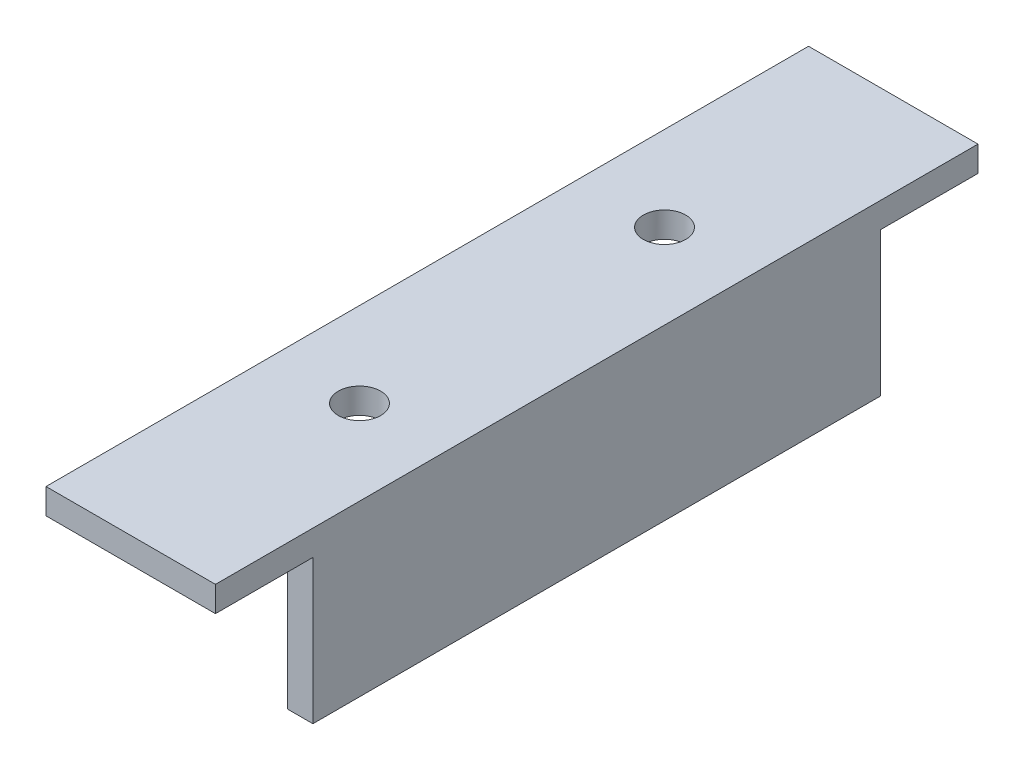
ISO-10303-21;
HEADER;
FILE_DESCRIPTION(('STEP AP214'),'2;1');
FILE_NAME('part.step','',(''),(''),'','','');
FILE_SCHEMA(('AUTOMOTIVE_DESIGN { 1 0 10303 214 1 1 1 1 }'));
ENDSEC;
DATA;
#1=APPLICATION_CONTEXT('core data for automotive mechanical design processes');
#2=APPLICATION_PROTOCOL_DEFINITION('international standard','automotive_design',2000,#1);
#3=PRODUCT_CONTEXT('',#1,'mechanical');
#4=PRODUCT('Part','Part','',(#3));
#5=PRODUCT_RELATED_PRODUCT_CATEGORY('part','',(#4));
#6=PRODUCT_DEFINITION_FORMATION('','',#4);
#7=PRODUCT_DEFINITION_CONTEXT('part definition',#1,'design');
#8=PRODUCT_DEFINITION('design','',#6,#7);
#9=PRODUCT_DEFINITION_SHAPE('','',#8);
#10=(LENGTH_UNIT() NAMED_UNIT(*) SI_UNIT(.MILLI.,.METRE.));
#11=(NAMED_UNIT(*) PLANE_ANGLE_UNIT() SI_UNIT($,.RADIAN.));
#12=(NAMED_UNIT(*) SI_UNIT($,.STERADIAN.) SOLID_ANGLE_UNIT());
#13=UNCERTAINTY_MEASURE_WITH_UNIT(LENGTH_MEASURE(1.E-05),#10,'distance_accuracy_value','');
#14=(GEOMETRIC_REPRESENTATION_CONTEXT(3) GLOBAL_UNCERTAINTY_ASSIGNED_CONTEXT((#13)) GLOBAL_UNIT_ASSIGNED_CONTEXT((#10,
#11,#12)) REPRESENTATION_CONTEXT('',''));
#15=CARTESIAN_POINT('',(0.,0.,0.));
#16=DIRECTION('',(0.,0.,1.));
#17=DIRECTION('',(1.,0.,0.));
#18=AXIS2_PLACEMENT_3D('',#15,#16,#17);
#19=CARTESIAN_POINT('',(0.,-6.,-180.));
#20=DIRECTION('',(-1.,0.,0.));
#21=DIRECTION('',(0.,0.,1.));
#22=AXIS2_PLACEMENT_3D('',#19,#20,#21);
#23=PLANE('',#22);
#24=DIRECTION('',(0.,-1.,0.));
#25=VECTOR('',#24,1.);
#26=CARTESIAN_POINT('',(0.,-6.,0.));
#27=LINE('',#26,#25);
#28=CARTESIAN_POINT('',(0.,0.,0.));
#29=VERTEX_POINT('',#28);
#30=CARTESIAN_POINT('',(0.,-6.,0.));
#31=VERTEX_POINT('',#30);
#32=EDGE_CURVE('E169',#29,#31,#27,.T.);
#33=ORIENTED_EDGE('',*,*,#32,.F.);
#34=DIRECTION('',(0.,0.,1.));
#35=VECTOR('',#34,1.);
#36=CARTESIAN_POINT('',(0.,0.,-180.));
#37=LINE('',#36,#35);
#38=CARTESIAN_POINT('',(0.,0.,-180.));
#39=VERTEX_POINT('',#38);
#40=EDGE_CURVE('E11',#39,#29,#37,.T.);
#41=ORIENTED_EDGE('',*,*,#40,.F.);
#42=DIRECTION('',(0.,-1.,0.));
#43=VECTOR('',#42,1.);
#44=CARTESIAN_POINT('',(0.,-6.,-180.));
#45=LINE('',#44,#43);
#46=CARTESIAN_POINT('',(0.,-6.,-180.));
#47=VERTEX_POINT('',#46);
#48=EDGE_CURVE('E170',#39,#47,#45,.T.);
#49=ORIENTED_EDGE('',*,*,#48,.T.);
#50=DIRECTION('',(0.,0.,1.));
#51=VECTOR('',#50,1.);
#52=CARTESIAN_POINT('',(0.,-6.,-180.));
#53=LINE('',#52,#51);
#54=EDGE_CURVE('E83',#47,#31,#53,.T.);
#55=ORIENTED_EDGE('',*,*,#54,.T.);
#56=EDGE_LOOP('',(#33,#41,#49,#55));
#57=FACE_BOUND('',#56,.T.);
#58=ADVANCED_FACE('F41',(#57),#23,.T.);
#59=CARTESIAN_POINT('',(0.,0.,-180.));
#60=DIRECTION('',(0.,1.,0.));
#61=DIRECTION('',(0.,0.,1.));
#62=AXIS2_PLACEMENT_3D('',#59,#60,#61);
#63=PLANE('',#62);
#64=CARTESIAN_POINT('',(20.,0.,-126.));
#65=DIRECTION('',(0.,1.,0.));
#66=DIRECTION('',(0.,0.,1.));
#67=AXIS2_PLACEMENT_3D('',#64,#65,#66);
#68=CIRCLE('',#67,5.);
#69=CARTESIAN_POINT('',(20.,0.,-121.));
#70=VERTEX_POINT('',#69);
#71=EDGE_CURVE('E145',#70,#70,#68,.T.);
#72=ORIENTED_EDGE('',*,*,#71,.F.);
#73=EDGE_LOOP('',(#72));
#74=FACE_BOUND('',#73,.T.);
#75=CARTESIAN_POINT('',(20.,0.,-54.));
#76=DIRECTION('',(0.,1.,0.));
#77=DIRECTION('',(0.,0.,-1.));
#78=AXIS2_PLACEMENT_3D('',#75,#76,#77);
#79=CIRCLE('',#78,5.);
#80=CARTESIAN_POINT('',(20.,0.,-59.));
#81=VERTEX_POINT('',#80);
#82=EDGE_CURVE('E150',#81,#81,#79,.T.);
#83=ORIENTED_EDGE('',*,*,#82,.F.);
#84=EDGE_LOOP('',(#83));
#85=FACE_BOUND('',#84,.T.);
#86=DIRECTION('',(-1.,0.,0.));
#87=VECTOR('',#86,1.);
#88=CARTESIAN_POINT('',(0.,0.,0.));
#89=LINE('',#88,#87);
#90=CARTESIAN_POINT('',(40.,0.,0.));
#91=VERTEX_POINT('',#90);
#92=EDGE_CURVE('E173',#91,#29,#89,.T.);
#93=ORIENTED_EDGE('',*,*,#92,.F.);
#94=DIRECTION('',(0.,0.,1.));
#95=VECTOR('',#94,1.);
#96=CARTESIAN_POINT('',(40.,0.,-180.));
#97=LINE('',#96,#95);
#98=CARTESIAN_POINT('',(40.,0.,-180.));
#99=VERTEX_POINT('',#98);
#100=EDGE_CURVE('E49',#99,#91,#97,.T.);
#101=ORIENTED_EDGE('',*,*,#100,.F.);
#102=DIRECTION('',(-1.,0.,0.));
#103=VECTOR('',#102,1.);
#104=CARTESIAN_POINT('',(0.,0.,-180.));
#105=LINE('',#104,#103);
#106=EDGE_CURVE('E140',#99,#39,#105,.T.);
#107=ORIENTED_EDGE('',*,*,#106,.T.);
#108=ORIENTED_EDGE('',*,*,#40,.T.);
#109=EDGE_LOOP('',(#93,#101,#107,#108));
#110=FACE_BOUND('',#109,.T.);
#111=ADVANCED_FACE('F201',(#74,#85,#110),#63,.T.);
#112=CARTESIAN_POINT('',(40.,0.,-180.));
#113=DIRECTION('',(1.,0.,0.));
#114=DIRECTION('',(0.,0.,-1.));
#115=AXIS2_PLACEMENT_3D('',#112,#113,#114);
#116=PLANE('',#115);
#117=DIRECTION('',(0.,1.,0.));
#118=VECTOR('',#117,1.);
#119=CARTESIAN_POINT('',(40.,0.,-23.));
#120=LINE('',#119,#118);
#121=CARTESIAN_POINT('',(40.,-40.,-23.));
#122=VERTEX_POINT('',#121);
#123=CARTESIAN_POINT('',(40.,-6.,-23.));
#124=VERTEX_POINT('',#123);
#125=EDGE_CURVE('E118',#122,#124,#120,.T.);
#126=ORIENTED_EDGE('',*,*,#125,.F.);
#127=DIRECTION('',(0.,0.,1.));
#128=VECTOR('',#127,1.);
#129=CARTESIAN_POINT('',(40.,-40.,-180.));
#130=LINE('',#129,#128);
#131=CARTESIAN_POINT('',(40.,-40.,-157.));
#132=VERTEX_POINT('',#131);
#133=EDGE_CURVE('E138',#132,#122,#130,.T.);
#134=ORIENTED_EDGE('',*,*,#133,.F.);
#135=DIRECTION('',(0.,-1.,0.));
#136=VECTOR('',#135,1.);
#137=CARTESIAN_POINT('',(40.,0.,-157.));
#138=LINE('',#137,#136);
#139=CARTESIAN_POINT('',(40.,-6.,-157.));
#140=VERTEX_POINT('',#139);
#141=EDGE_CURVE('E166',#140,#132,#138,.T.);
#142=ORIENTED_EDGE('',*,*,#141,.F.);
#143=DIRECTION('',(0.,0.,1.));
#144=VECTOR('',#143,1.);
#145=CARTESIAN_POINT('',(40.,-6.,-180.));
#146=LINE('',#145,#144);
#147=CARTESIAN_POINT('',(40.,-6.,-180.));
#148=VERTEX_POINT('',#147);
#149=EDGE_CURVE('E164',#148,#140,#146,.T.);
#150=ORIENTED_EDGE('',*,*,#149,.F.);
#151=DIRECTION('',(0.,1.,0.));
#152=VECTOR('',#151,1.);
#153=CARTESIAN_POINT('',(40.,0.,-180.));
#154=LINE('',#153,#152);
#155=EDGE_CURVE('E175',#148,#99,#154,.T.);
#156=ORIENTED_EDGE('',*,*,#155,.T.);
#157=ORIENTED_EDGE('',*,*,#100,.T.);
#158=DIRECTION('',(0.,1.,0.));
#159=VECTOR('',#158,1.);
#160=CARTESIAN_POINT('',(40.,0.,0.));
#161=LINE('',#160,#159);
#162=CARTESIAN_POINT('',(40.,-6.,0.));
#163=VERTEX_POINT('',#162);
#164=EDGE_CURVE('E180',#163,#91,#161,.T.);
#165=ORIENTED_EDGE('',*,*,#164,.F.);
#166=DIRECTION('',(0.,0.,1.));
#167=VECTOR('',#166,1.);
#168=CARTESIAN_POINT('',(40.,-6.00000000000002,-180.));
#169=LINE('',#168,#167);
#170=EDGE_CURVE('E157',#124,#163,#169,.T.);
#171=ORIENTED_EDGE('',*,*,#170,.F.);
#172=EDGE_LOOP('',(#126,#134,#142,#150,#156,#157,#165,#171));
#173=FACE_BOUND('',#172,.T.);
#174=ADVANCED_FACE('F192',(#173),#116,.T.);
#175=CARTESIAN_POINT('',(34.,-40.,-180.));
#176=DIRECTION('',(0.,-1.,0.));
#177=DIRECTION('',(0.,0.,-1.));
#178=AXIS2_PLACEMENT_3D('',#175,#176,#177);
#179=PLANE('',#178);
#180=DIRECTION('',(-1.,0.,0.));
#181=VECTOR('',#180,1.);
#182=CARTESIAN_POINT('',(234.,-40.,-23.));
#183=LINE('',#182,#181);
#184=CARTESIAN_POINT('',(34.,-40.,-23.));
#185=VERTEX_POINT('',#184);
#186=EDGE_CURVE('E121',#122,#185,#183,.T.);
#187=ORIENTED_EDGE('',*,*,#186,.T.);
#188=DIRECTION('',(0.,0.,1.));
#189=VECTOR('',#188,1.);
#190=CARTESIAN_POINT('',(34.,-40.,-180.));
#191=LINE('',#190,#189);
#192=CARTESIAN_POINT('',(34.,-40.,-157.));
#193=VERTEX_POINT('',#192);
#194=EDGE_CURVE('E130',#193,#185,#191,.T.);
#195=ORIENTED_EDGE('',*,*,#194,.F.);
#196=DIRECTION('',(-1.,0.,0.));
#197=VECTOR('',#196,1.);
#198=CARTESIAN_POINT('',(234.,-40.,-157.));
#199=LINE('',#198,#197);
#200=EDGE_CURVE('E159',#132,#193,#199,.T.);
#201=ORIENTED_EDGE('',*,*,#200,.F.);
#202=ORIENTED_EDGE('',*,*,#133,.T.);
#203=EDGE_LOOP('',(#187,#195,#201,#202));
#204=FACE_BOUND('',#203,.T.);
#205=ADVANCED_FACE('F189',(#204),#179,.T.);
#206=CARTESIAN_POINT('',(34.,-6.,-180.));
#207=DIRECTION('',(-1.,0.,0.));
#208=DIRECTION('',(0.,0.,1.));
#209=AXIS2_PLACEMENT_3D('',#206,#207,#208);
#210=PLANE('',#209);
#211=DIRECTION('',(0.,-1.,0.));
#212=VECTOR('',#211,1.);
#213=CARTESIAN_POINT('',(34.,-6.,-23.));
#214=LINE('',#213,#212);
#215=CARTESIAN_POINT('',(34.,-6.,-23.));
#216=VERTEX_POINT('',#215);
#217=EDGE_CURVE('E115',#216,#185,#214,.T.);
#218=ORIENTED_EDGE('',*,*,#217,.F.);
#219=DIRECTION('',(0.,0.,1.));
#220=VECTOR('',#219,1.);
#221=CARTESIAN_POINT('',(34.,-6.,-180.));
#222=LINE('',#221,#220);
#223=CARTESIAN_POINT('',(34.,-6.,-157.));
#224=VERTEX_POINT('',#223);
#225=EDGE_CURVE('E128',#224,#216,#222,.T.);
#226=ORIENTED_EDGE('',*,*,#225,.F.);
#227=DIRECTION('',(0.,1.,0.));
#228=VECTOR('',#227,1.);
#229=CARTESIAN_POINT('',(34.,-6.,-157.));
#230=LINE('',#229,#228);
#231=EDGE_CURVE('E131',#193,#224,#230,.T.);
#232=ORIENTED_EDGE('',*,*,#231,.F.);
#233=ORIENTED_EDGE('',*,*,#194,.T.);
#234=EDGE_LOOP('',(#218,#226,#232,#233));
#235=FACE_BOUND('',#234,.T.);
#236=ADVANCED_FACE('F126',(#235),#210,.T.);
#237=CARTESIAN_POINT('',(0.,-6.,-180.));
#238=DIRECTION('',(0.,-1.,0.));
#239=DIRECTION('',(0.,0.,-1.));
#240=AXIS2_PLACEMENT_3D('',#237,#238,#239);
#241=PLANE('',#240);
#242=CARTESIAN_POINT('',(20.,-6.00000000000001,-126.));
#243=DIRECTION('',(0.,-1.,0.));
#244=DIRECTION('',(0.,0.,-1.));
#245=AXIS2_PLACEMENT_3D('',#242,#243,#244);
#246=CIRCLE('',#245,5.);
#247=CARTESIAN_POINT('',(20.,-6.00000000000001,-131.));
#248=VERTEX_POINT('',#247);
#249=EDGE_CURVE('E44',#248,#248,#246,.T.);
#250=ORIENTED_EDGE('',*,*,#249,.F.);
#251=EDGE_LOOP('',(#250));
#252=FACE_BOUND('',#251,.T.);
#253=CARTESIAN_POINT('',(20.,-6.00000000000001,-54.));
#254=DIRECTION('',(0.,-1.,0.));
#255=DIRECTION('',(0.,0.,-1.));
#256=AXIS2_PLACEMENT_3D('',#253,#254,#255);
#257=CIRCLE('',#256,5.);
#258=CARTESIAN_POINT('',(20.,-6.00000000000001,-59.));
#259=VERTEX_POINT('',#258);
#260=EDGE_CURVE('E143',#259,#259,#257,.T.);
#261=ORIENTED_EDGE('',*,*,#260,.F.);
#262=EDGE_LOOP('',(#261));
#263=FACE_BOUND('',#262,.T.);
#264=DIRECTION('',(1.,0.,0.));
#265=VECTOR('',#264,1.);
#266=CARTESIAN_POINT('',(0.,-6.,0.));
#267=LINE('',#266,#265);
#268=EDGE_CURVE('E57',#31,#163,#267,.T.);
#269=ORIENTED_EDGE('',*,*,#268,.F.);
#270=ORIENTED_EDGE('',*,*,#54,.F.);
#271=DIRECTION('',(1.,0.,0.));
#272=VECTOR('',#271,1.);
#273=CARTESIAN_POINT('',(0.,-6.,-180.));
#274=LINE('',#273,#272);
#275=EDGE_CURVE('E172',#47,#148,#274,.T.);
#276=ORIENTED_EDGE('',*,*,#275,.T.);
#277=ORIENTED_EDGE('',*,*,#149,.T.);
#278=DIRECTION('',(-1.,0.,0.));
#279=VECTOR('',#278,1.);
#280=CARTESIAN_POINT('',(234.,-6.,-157.));
#281=LINE('',#280,#279);
#282=EDGE_CURVE('E135',#140,#224,#281,.T.);
#283=ORIENTED_EDGE('',*,*,#282,.T.);
#284=ORIENTED_EDGE('',*,*,#225,.T.);
#285=DIRECTION('',(-1.,0.,0.));
#286=VECTOR('',#285,1.);
#287=CARTESIAN_POINT('',(234.,-6.,-23.));
#288=LINE('',#287,#286);
#289=EDGE_CURVE('E112',#124,#216,#288,.T.);
#290=ORIENTED_EDGE('',*,*,#289,.F.);
#291=ORIENTED_EDGE('',*,*,#170,.T.);
#292=EDGE_LOOP('',(#269,#270,#276,#277,#283,#284,#290,#291));
#293=FACE_BOUND('',#292,.T.);
#294=ADVANCED_FACE('F133',(#252,#263,#293),#241,.T.);
#295=CARTESIAN_POINT('',(0.,0.,-180.));
#296=DIRECTION('',(0.,0.,-1.));
#297=DIRECTION('',(-1.,0.,0.));
#298=AXIS2_PLACEMENT_3D('',#295,#296,#297);
#299=PLANE('',#298);
#300=ORIENTED_EDGE('',*,*,#155,.F.);
#301=ORIENTED_EDGE('',*,*,#275,.F.);
#302=ORIENTED_EDGE('',*,*,#48,.F.);
#303=ORIENTED_EDGE('',*,*,#106,.F.);
#304=EDGE_LOOP('',(#300,#301,#302,#303));
#305=FACE_BOUND('',#304,.T.);
#306=ADVANCED_FACE('F199',(#305),#299,.T.);
#307=CARTESIAN_POINT('',(0.,0.,0.));
#308=DIRECTION('',(0.,0.,-1.));
#309=DIRECTION('',(-1.,0.,0.));
#310=AXIS2_PLACEMENT_3D('',#307,#308,#309);
#311=PLANE('',#310);
#312=ORIENTED_EDGE('',*,*,#268,.T.);
#313=ORIENTED_EDGE('',*,*,#164,.T.);
#314=ORIENTED_EDGE('',*,*,#92,.T.);
#315=ORIENTED_EDGE('',*,*,#32,.T.);
#316=EDGE_LOOP('',(#312,#313,#314,#315));
#317=FACE_BOUND('',#316,.T.);
#318=ADVANCED_FACE('F195',(#317),#311,.F.);
#319=CARTESIAN_POINT('',(234.,-6.,-23.));
#320=DIRECTION('',(0.,0.,-1.));
#321=DIRECTION('',(0.,1.,0.));
#322=AXIS2_PLACEMENT_3D('',#319,#320,#321);
#323=PLANE('',#322);
#324=ORIENTED_EDGE('',*,*,#125,.T.);
#325=ORIENTED_EDGE('',*,*,#289,.T.);
#326=ORIENTED_EDGE('',*,*,#217,.T.);
#327=ORIENTED_EDGE('',*,*,#186,.F.);
#328=EDGE_LOOP('',(#324,#325,#326,#327));
#329=FACE_BOUND('',#328,.T.);
#330=ADVANCED_FACE('F114',(#329),#323,.F.);
#331=CARTESIAN_POINT('',(234.,-6.,-157.));
#332=DIRECTION('',(0.,0.,1.));
#333=DIRECTION('',(1.,0.,0.));
#334=AXIS2_PLACEMENT_3D('',#331,#332,#333);
#335=PLANE('',#334);
#336=ORIENTED_EDGE('',*,*,#141,.T.);
#337=ORIENTED_EDGE('',*,*,#200,.T.);
#338=ORIENTED_EDGE('',*,*,#231,.T.);
#339=ORIENTED_EDGE('',*,*,#282,.F.);
#340=EDGE_LOOP('',(#336,#337,#338,#339));
#341=FACE_BOUND('',#340,.T.);
#342=ADVANCED_FACE('F203',(#341),#335,.F.);
#343=CARTESIAN_POINT('',(20.,-200.,-54.));
#344=DIRECTION('',(0.,1.,0.));
#345=DIRECTION('',(0.,0.,1.));
#346=AXIS2_PLACEMENT_3D('',#343,#344,#345);
#347=CYLINDRICAL_SURFACE('',#346,5.);
#348=ORIENTED_EDGE('',*,*,#260,.T.);
#349=EDGE_LOOP('',(#348));
#350=FACE_BOUND('',#349,.T.);
#351=ORIENTED_EDGE('',*,*,#82,.T.);
#352=EDGE_LOOP('',(#351));
#353=FACE_BOUND('',#352,.T.);
#354=ADVANCED_FACE('F205',(#350,#353),#347,.F.);
#355=CARTESIAN_POINT('',(20.,-200.,-126.));
#356=DIRECTION('',(0.,1.,0.));
#357=DIRECTION('',(0.,0.,1.));
#358=AXIS2_PLACEMENT_3D('',#355,#356,#357);
#359=CYLINDRICAL_SURFACE('',#358,5.);
#360=ORIENTED_EDGE('',*,*,#249,.T.);
#361=EDGE_LOOP('',(#360));
#362=FACE_BOUND('',#361,.T.);
#363=ORIENTED_EDGE('',*,*,#71,.T.);
#364=EDGE_LOOP('',(#363));
#365=FACE_BOUND('',#364,.T.);
#366=ADVANCED_FACE('F212',(#362,#365),#359,.F.);
#367=CLOSED_SHELL('',(#58,#111,#174,#205,#236,#294,#306,#318,#330,#342,#354,#366));
#368=MANIFOLD_SOLID_BREP('B2',#367);
#369=ADVANCED_BREP_SHAPE_REPRESENTATION('',(#18,#368),#14);
#370=SHAPE_DEFINITION_REPRESENTATION(#9,#369);
ENDSEC;
END-ISO-10303-21;
